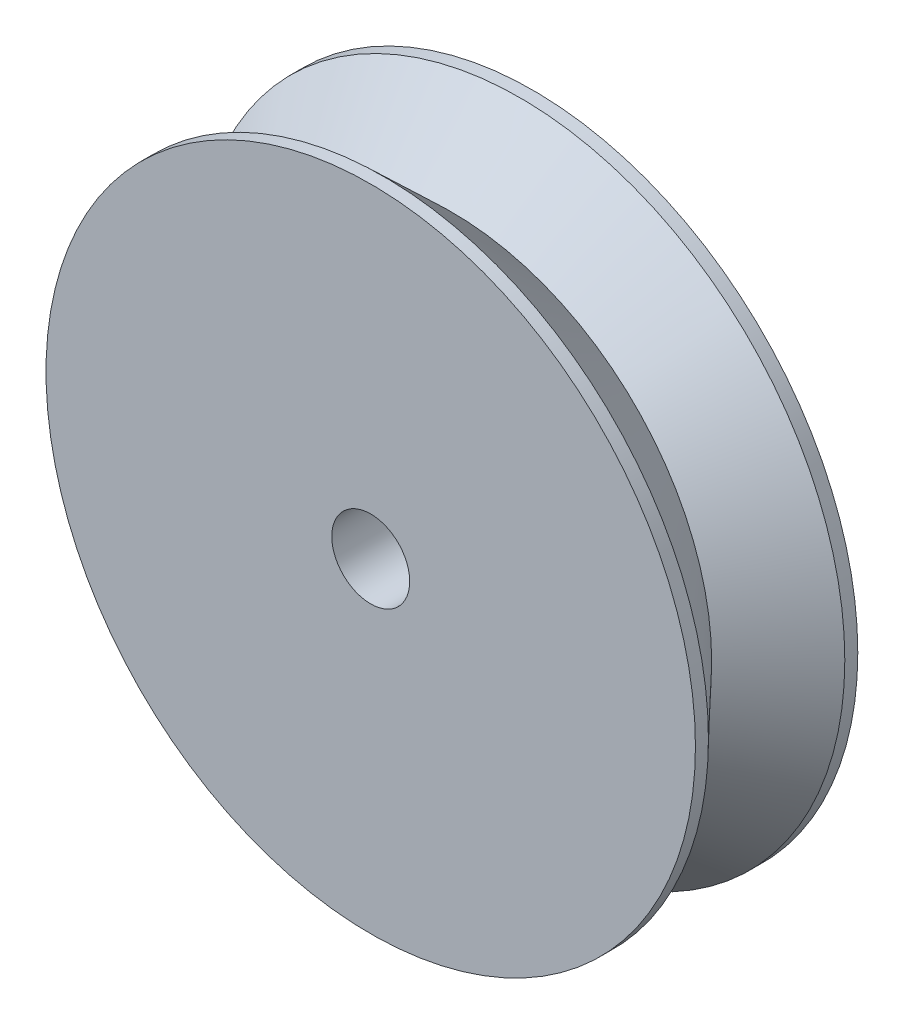
ISO-10303-21;
HEADER;
FILE_DESCRIPTION(('STEP AP214'),'2;1');
FILE_NAME('part.step','',(''),(''),'','','');
FILE_SCHEMA(('AUTOMOTIVE_DESIGN { 1 0 10303 214 1 1 1 1 }'));
ENDSEC;
DATA;
#1=APPLICATION_CONTEXT('core data for automotive mechanical design processes');
#2=APPLICATION_PROTOCOL_DEFINITION('international standard','automotive_design',2000,#1);
#3=PRODUCT_CONTEXT('',#1,'mechanical');
#4=PRODUCT('Part','Part','',(#3));
#5=PRODUCT_RELATED_PRODUCT_CATEGORY('part','',(#4));
#6=PRODUCT_DEFINITION_FORMATION('','',#4);
#7=PRODUCT_DEFINITION_CONTEXT('part definition',#1,'design');
#8=PRODUCT_DEFINITION('design','',#6,#7);
#9=PRODUCT_DEFINITION_SHAPE('','',#8);
#10=(LENGTH_UNIT() NAMED_UNIT(*) SI_UNIT(.MILLI.,.METRE.));
#11=(NAMED_UNIT(*) PLANE_ANGLE_UNIT() SI_UNIT($,.RADIAN.));
#12=(NAMED_UNIT(*) SI_UNIT($,.STERADIAN.) SOLID_ANGLE_UNIT());
#13=UNCERTAINTY_MEASURE_WITH_UNIT(LENGTH_MEASURE(1.E-05),#10,'distance_accuracy_value','');
#14=(GEOMETRIC_REPRESENTATION_CONTEXT(3) GLOBAL_UNCERTAINTY_ASSIGNED_CONTEXT((#13)) GLOBAL_UNIT_ASSIGNED_CONTEXT((#10,
#11,#12)) REPRESENTATION_CONTEXT('',''));
#15=CARTESIAN_POINT('',(0.,0.,0.));
#16=DIRECTION('',(0.,0.,1.));
#17=DIRECTION('',(1.,0.,0.));
#18=AXIS2_PLACEMENT_3D('',#15,#16,#17);
#19=CARTESIAN_POINT('',(0.,12.7,0.));
#20=DIRECTION('',(0.,0.,-1.));
#21=DIRECTION('',(-1.,0.,0.));
#22=AXIS2_PLACEMENT_3D('',#19,#20,#21);
#23=PLANE('',#22);
#24=CARTESIAN_POINT('',(0.,0.,0.));
#25=DIRECTION('',(0.,0.,1.));
#26=DIRECTION('',(1.,0.,0.));
#27=AXIS2_PLACEMENT_3D('',#24,#25,#26);
#28=CIRCLE('',#27,1.524);
#29=CARTESIAN_POINT('',(1.524,0.,0.));
#30=VERTEX_POINT('',#29);
#31=EDGE_CURVE('E54',#30,#30,#28,.T.);
#32=ORIENTED_EDGE('',*,*,#31,.F.);
#33=EDGE_LOOP('',(#32));
#34=FACE_BOUND('',#33,.T.);
#35=CARTESIAN_POINT('',(0.,0.,0.));
#36=DIRECTION('',(0.,0.,1.));
#37=DIRECTION('',(1.,0.,0.));
#38=AXIS2_PLACEMENT_3D('',#35,#36,#37);
#39=CIRCLE('',#38,12.7);
#40=CARTESIAN_POINT('',(12.7,0.,0.));
#41=VERTEX_POINT('',#40);
#42=EDGE_CURVE('E50',#41,#41,#39,.T.);
#43=ORIENTED_EDGE('',*,*,#42,.T.);
#44=EDGE_LOOP('',(#43));
#45=FACE_BOUND('',#44,.T.);
#46=ADVANCED_FACE('F31',(#34,#45),#23,.F.);
#47=CARTESIAN_POINT('',(0.,0.,-6.35));
#48=DIRECTION('',(0.,0.,1.));
#49=DIRECTION('',(1.,0.,0.));
#50=AXIS2_PLACEMENT_3D('',#47,#48,#49);
#51=PLANE('',#50);
#52=CARTESIAN_POINT('',(0.,0.,-6.35));
#53=DIRECTION('',(0.,0.,1.));
#54=DIRECTION('',(1.,0.,0.));
#55=AXIS2_PLACEMENT_3D('',#52,#53,#54);
#56=CIRCLE('',#55,1.524);
#57=CARTESIAN_POINT('',(1.524,0.,-6.35));
#58=VERTEX_POINT('',#57);
#59=EDGE_CURVE('E53',#58,#58,#56,.T.);
#60=ORIENTED_EDGE('',*,*,#59,.T.);
#61=EDGE_LOOP('',(#60));
#62=FACE_BOUND('',#61,.T.);
#63=CARTESIAN_POINT('',(0.,0.,-6.35));
#64=DIRECTION('',(0.,0.,1.));
#65=DIRECTION('',(1.,0.,0.));
#66=AXIS2_PLACEMENT_3D('',#63,#64,#65);
#67=CIRCLE('',#66,12.7);
#68=CARTESIAN_POINT('',(12.7,0.,-6.35));
#69=VERTEX_POINT('',#68);
#70=EDGE_CURVE('E10',#69,#69,#67,.T.);
#71=ORIENTED_EDGE('',*,*,#70,.F.);
#72=EDGE_LOOP('',(#71));
#73=FACE_BOUND('',#72,.T.);
#74=ADVANCED_FACE('F60',(#62,#73),#51,.F.);
#75=CARTESIAN_POINT('',(0.,0.,0.));
#76=DIRECTION('',(0.,0.,1.));
#77=DIRECTION('',(1.,0.,0.));
#78=AXIS2_PLACEMENT_3D('',#75,#76,#77);
#79=CYLINDRICAL_SURFACE('',#78,12.7);
#80=CARTESIAN_POINT('',(0.,0.,-5.842));
#81=DIRECTION('',(0.,0.,1.));
#82=DIRECTION('',(1.,0.,0.));
#83=AXIS2_PLACEMENT_3D('',#80,#81,#82);
#84=CIRCLE('',#83,12.7);
#85=CARTESIAN_POINT('',(12.7,0.,-5.842));
#86=VERTEX_POINT('',#85);
#87=EDGE_CURVE('E37',#86,#86,#84,.T.);
#88=ORIENTED_EDGE('',*,*,#87,.F.);
#89=EDGE_LOOP('',(#88));
#90=FACE_BOUND('',#89,.T.);
#91=ORIENTED_EDGE('',*,*,#70,.T.);
#92=EDGE_LOOP('',(#91));
#93=FACE_BOUND('',#92,.T.);
#94=ADVANCED_FACE('F87',(#90,#93),#79,.T.);
#95=CARTESIAN_POINT('',(0.,0.,-5.842));
#96=DIRECTION('',(0.,0.,-1.));
#97=DIRECTION('',(-1.,0.,0.));
#98=AXIS2_PLACEMENT_3D('',#95,#96,#97);
#99=CONICAL_SURFACE('',#98,12.7,0.76101275422473);
#100=CARTESIAN_POINT('',(0.,0.,-3.175));
#101=DIRECTION('',(0.,0.,1.));
#102=DIRECTION('',(1.,0.,0.));
#103=AXIS2_PLACEMENT_3D('',#100,#101,#102);
#104=CIRCLE('',#103,10.16);
#105=CARTESIAN_POINT('',(10.16,0.,-3.175));
#106=VERTEX_POINT('',#105);
#107=EDGE_CURVE('E41',#106,#106,#104,.T.);
#108=ORIENTED_EDGE('',*,*,#107,.F.);
#109=EDGE_LOOP('',(#108));
#110=FACE_BOUND('',#109,.T.);
#111=ORIENTED_EDGE('',*,*,#87,.T.);
#112=EDGE_LOOP('',(#111));
#113=FACE_BOUND('',#112,.T.);
#114=ADVANCED_FACE('F82',(#110,#113),#99,.T.);
#115=CARTESIAN_POINT('',(0.,0.,-3.175));
#116=DIRECTION('',(0.,0.,1.));
#117=DIRECTION('',(1.,0.,0.));
#118=AXIS2_PLACEMENT_3D('',#115,#116,#117);
#119=CONICAL_SURFACE('',#118,10.16,0.76101275422473);
#120=CARTESIAN_POINT('',(0.,0.,-0.508));
#121=DIRECTION('',(0.,0.,1.));
#122=DIRECTION('',(1.,0.,0.));
#123=AXIS2_PLACEMENT_3D('',#120,#121,#122);
#124=CIRCLE('',#123,12.7);
#125=CARTESIAN_POINT('',(12.7,0.,-0.508));
#126=VERTEX_POINT('',#125);
#127=EDGE_CURVE('E45',#126,#126,#124,.T.);
#128=ORIENTED_EDGE('',*,*,#127,.F.);
#129=EDGE_LOOP('',(#128));
#130=FACE_BOUND('',#129,.T.);
#131=ORIENTED_EDGE('',*,*,#107,.T.);
#132=EDGE_LOOP('',(#131));
#133=FACE_BOUND('',#132,.T.);
#134=ADVANCED_FACE('F76',(#130,#133),#119,.T.);
#135=CARTESIAN_POINT('',(0.,0.,0.));
#136=DIRECTION('',(0.,0.,1.));
#137=DIRECTION('',(1.,0.,0.));
#138=AXIS2_PLACEMENT_3D('',#135,#136,#137);
#139=CYLINDRICAL_SURFACE('',#138,12.7);
#140=ORIENTED_EDGE('',*,*,#42,.F.);
#141=EDGE_LOOP('',(#140));
#142=FACE_BOUND('',#141,.T.);
#143=ORIENTED_EDGE('',*,*,#127,.T.);
#144=EDGE_LOOP('',(#143));
#145=FACE_BOUND('',#144,.T.);
#146=ADVANCED_FACE('F66',(#142,#145),#139,.T.);
#147=CARTESIAN_POINT('',(0.,0.,-6.35));
#148=DIRECTION('',(0.,0.,1.));
#149=DIRECTION('',(1.,0.,0.));
#150=AXIS2_PLACEMENT_3D('',#147,#148,#149);
#151=CYLINDRICAL_SURFACE('',#150,1.524);
#152=ORIENTED_EDGE('',*,*,#59,.F.);
#153=EDGE_LOOP('',(#152));
#154=FACE_BOUND('',#153,.T.);
#155=ORIENTED_EDGE('',*,*,#31,.T.);
#156=EDGE_LOOP('',(#155));
#157=FACE_BOUND('',#156,.T.);
#158=ADVANCED_FACE('F63',(#154,#157),#151,.F.);
#159=CLOSED_SHELL('',(#46,#74,#94,#114,#134,#146,#158));
#160=MANIFOLD_SOLID_BREP('B2',#159);
#161=ADVANCED_BREP_SHAPE_REPRESENTATION('',(#18,#160),#14);
#162=SHAPE_DEFINITION_REPRESENTATION(#9,#161);
ENDSEC;
END-ISO-10303-21;
